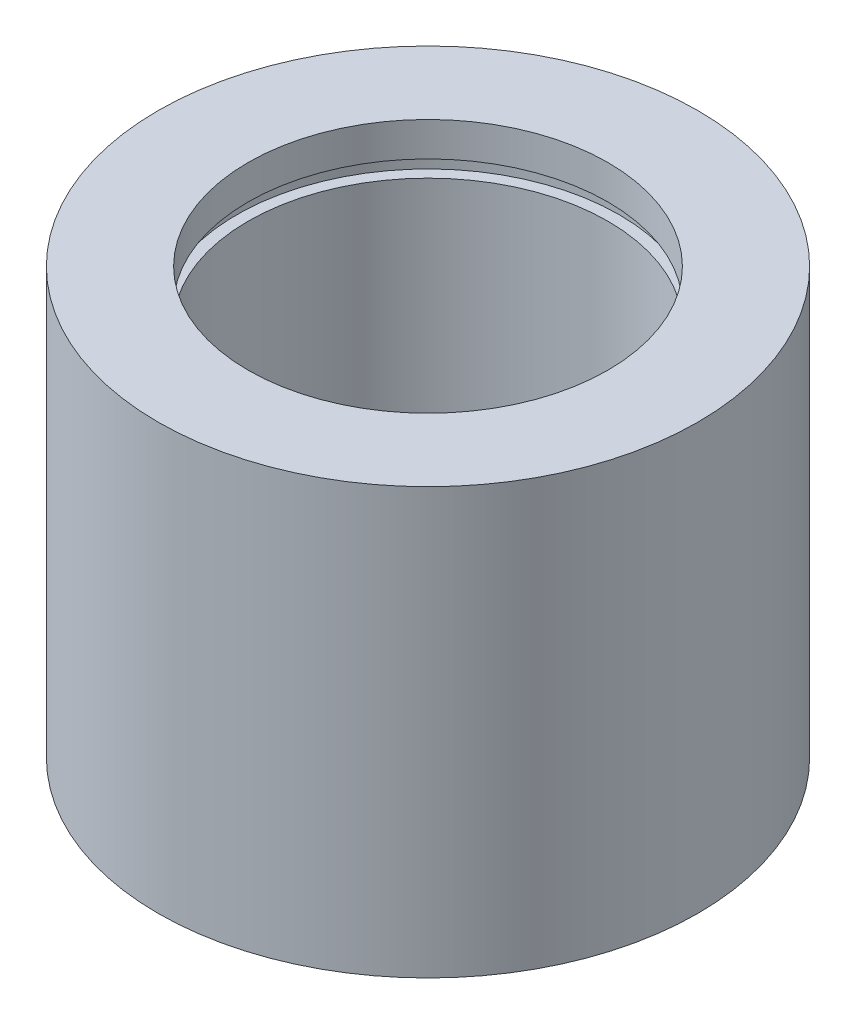
ISO-10303-21;
HEADER;
FILE_DESCRIPTION(('STEP AP214'),'2;1');
FILE_NAME('part.step','',(''),(''),'','','');
FILE_SCHEMA(('AUTOMOTIVE_DESIGN { 1 0 10303 214 1 1 1 1 }'));
ENDSEC;
DATA;
#1=APPLICATION_CONTEXT('core data for automotive mechanical design processes');
#2=APPLICATION_PROTOCOL_DEFINITION('international standard','automotive_design',2000,#1);
#3=PRODUCT_CONTEXT('',#1,'mechanical');
#4=PRODUCT('Part','Part','',(#3));
#5=PRODUCT_RELATED_PRODUCT_CATEGORY('part','',(#4));
#6=PRODUCT_DEFINITION_FORMATION('','',#4);
#7=PRODUCT_DEFINITION_CONTEXT('part definition',#1,'design');
#8=PRODUCT_DEFINITION('design','',#6,#7);
#9=PRODUCT_DEFINITION_SHAPE('','',#8);
#10=(LENGTH_UNIT() NAMED_UNIT(*) SI_UNIT(.MILLI.,.METRE.));
#11=(NAMED_UNIT(*) PLANE_ANGLE_UNIT() SI_UNIT($,.RADIAN.));
#12=(NAMED_UNIT(*) SI_UNIT($,.STERADIAN.) SOLID_ANGLE_UNIT());
#13=UNCERTAINTY_MEASURE_WITH_UNIT(LENGTH_MEASURE(1.E-05),#10,'distance_accuracy_value','');
#14=(GEOMETRIC_REPRESENTATION_CONTEXT(3) GLOBAL_UNCERTAINTY_ASSIGNED_CONTEXT((#13)) GLOBAL_UNIT_ASSIGNED_CONTEXT((#10,
#11,#12)) REPRESENTATION_CONTEXT('',''));
#15=CARTESIAN_POINT('',(0.,0.,0.));
#16=DIRECTION('',(0.,0.,1.));
#17=DIRECTION('',(1.,0.,0.));
#18=AXIS2_PLACEMENT_3D('',#15,#16,#17);
#19=CARTESIAN_POINT('',(0.,0.,0.));
#20=DIRECTION('',(0.,-1.,0.));
#21=DIRECTION('',(0.,0.,-1.));
#22=AXIS2_PLACEMENT_3D('',#19,#20,#21);
#23=CYLINDRICAL_SURFACE('',#22,20.);
#24=CARTESIAN_POINT('',(0.,0.,0.));
#25=DIRECTION('',(0.,-1.,0.));
#26=DIRECTION('',(0.,0.,-1.));
#27=AXIS2_PLACEMENT_3D('',#24,#25,#26);
#28=CIRCLE('',#27,20.);
#29=CARTESIAN_POINT('',(0.,0.,-20.));
#30=VERTEX_POINT('',#29);
#31=EDGE_CURVE('E10',#30,#30,#28,.T.);
#32=ORIENTED_EDGE('',*,*,#31,.T.);
#33=EDGE_LOOP('',(#32));
#34=FACE_BOUND('',#33,.T.);
#35=CARTESIAN_POINT('',(0.,3.8,0.));
#36=DIRECTION('',(0.,-1.,0.));
#37=DIRECTION('',(0.,0.,-1.));
#38=AXIS2_PLACEMENT_3D('',#35,#36,#37);
#39=CIRCLE('',#38,20.);
#40=CARTESIAN_POINT('',(0.,3.8,-20.));
#41=VERTEX_POINT('',#40);
#42=EDGE_CURVE('E86',#41,#41,#39,.T.);
#43=ORIENTED_EDGE('',*,*,#42,.F.);
#44=EDGE_LOOP('',(#43));
#45=FACE_BOUND('',#44,.T.);
#46=ADVANCED_FACE('F33',(#34,#45),#23,.F.);
#47=CARTESIAN_POINT('',(20.,0.,0.));
#48=DIRECTION('',(0.,-1.,0.));
#49=DIRECTION('',(0.,0.,-1.));
#50=AXIS2_PLACEMENT_3D('',#47,#48,#49);
#51=PLANE('',#50);
#52=CARTESIAN_POINT('',(0.,0.,0.));
#53=DIRECTION('',(0.,-1.,0.));
#54=DIRECTION('',(0.,0.,-1.));
#55=AXIS2_PLACEMENT_3D('',#52,#53,#54);
#56=CIRCLE('',#55,30.);
#57=CARTESIAN_POINT('',(0.,0.,-30.));
#58=VERTEX_POINT('',#57);
#59=EDGE_CURVE('E40',#58,#58,#56,.T.);
#60=ORIENTED_EDGE('',*,*,#59,.T.);
#61=EDGE_LOOP('',(#60));
#62=FACE_BOUND('',#61,.T.);
#63=ORIENTED_EDGE('',*,*,#31,.F.);
#64=EDGE_LOOP('',(#63));
#65=FACE_BOUND('',#64,.T.);
#66=ADVANCED_FACE('F96',(#62,#65),#51,.T.);
#67=CARTESIAN_POINT('',(0.,0.,0.));
#68=DIRECTION('',(0.,-1.,0.));
#69=DIRECTION('',(0.,0.,-1.));
#70=AXIS2_PLACEMENT_3D('',#67,#68,#69);
#71=CYLINDRICAL_SURFACE('',#70,30.);
#72=CARTESIAN_POINT('',(0.,47.3,0.));
#73=DIRECTION('',(0.,-1.,0.));
#74=DIRECTION('',(0.,0.,-1.));
#75=AXIS2_PLACEMENT_3D('',#72,#73,#74);
#76=CIRCLE('',#75,30.);
#77=CARTESIAN_POINT('',(0.,47.3,-30.));
#78=VERTEX_POINT('',#77);
#79=EDGE_CURVE('E46',#78,#78,#76,.T.);
#80=ORIENTED_EDGE('',*,*,#79,.T.);
#81=EDGE_LOOP('',(#80));
#82=FACE_BOUND('',#81,.T.);
#83=ORIENTED_EDGE('',*,*,#59,.F.);
#84=EDGE_LOOP('',(#83));
#85=FACE_BOUND('',#84,.T.);
#86=ADVANCED_FACE('F100',(#82,#85),#71,.T.);
#87=CARTESIAN_POINT('',(30.,47.3,0.));
#88=DIRECTION('',(0.,1.,0.));
#89=DIRECTION('',(0.,0.,1.));
#90=AXIS2_PLACEMENT_3D('',#87,#88,#89);
#91=PLANE('',#90);
#92=CARTESIAN_POINT('',(0.,47.3,0.));
#93=DIRECTION('',(0.,-1.,0.));
#94=DIRECTION('',(0.,0.,-1.));
#95=AXIS2_PLACEMENT_3D('',#92,#93,#94);
#96=CIRCLE('',#95,20.);
#97=CARTESIAN_POINT('',(0.,47.3,-20.));
#98=VERTEX_POINT('',#97);
#99=EDGE_CURVE('E52',#98,#98,#96,.T.);
#100=ORIENTED_EDGE('',*,*,#99,.T.);
#101=EDGE_LOOP('',(#100));
#102=FACE_BOUND('',#101,.T.);
#103=ORIENTED_EDGE('',*,*,#79,.F.);
#104=EDGE_LOOP('',(#103));
#105=FACE_BOUND('',#104,.T.);
#106=ADVANCED_FACE('F104',(#102,#105),#91,.T.);
#107=CARTESIAN_POINT('',(0.,0.,0.));
#108=DIRECTION('',(0.,-1.,0.));
#109=DIRECTION('',(0.,0.,-1.));
#110=AXIS2_PLACEMENT_3D('',#107,#108,#109);
#111=CYLINDRICAL_SURFACE('',#110,20.);
#112=CARTESIAN_POINT('',(0.,43.5,0.));
#113=DIRECTION('',(0.,-1.,0.));
#114=DIRECTION('',(0.,0.,-1.));
#115=AXIS2_PLACEMENT_3D('',#112,#113,#114);
#116=CIRCLE('',#115,20.);
#117=CARTESIAN_POINT('',(0.,43.5,-20.));
#118=VERTEX_POINT('',#117);
#119=EDGE_CURVE('E58',#118,#118,#116,.T.);
#120=ORIENTED_EDGE('',*,*,#119,.T.);
#121=EDGE_LOOP('',(#120));
#122=FACE_BOUND('',#121,.T.);
#123=ORIENTED_EDGE('',*,*,#99,.F.);
#124=EDGE_LOOP('',(#123));
#125=FACE_BOUND('',#124,.T.);
#126=ADVANCED_FACE('F111',(#122,#125),#111,.F.);
#127=CARTESIAN_POINT('',(20.,43.5,0.));
#128=DIRECTION('',(0.,-1.,0.));
#129=DIRECTION('',(0.,0.,-1.));
#130=AXIS2_PLACEMENT_3D('',#127,#128,#129);
#131=PLANE('',#130);
#132=CARTESIAN_POINT('',(0.,43.5,0.));
#133=DIRECTION('',(0.,-1.,0.));
#134=DIRECTION('',(0.,0.,-1.));
#135=AXIS2_PLACEMENT_3D('',#132,#133,#134);
#136=CIRCLE('',#135,21.25);
#137=CARTESIAN_POINT('',(0.,43.5,-21.25));
#138=VERTEX_POINT('',#137);
#139=EDGE_CURVE('E62',#138,#138,#136,.T.);
#140=ORIENTED_EDGE('',*,*,#139,.T.);
#141=EDGE_LOOP('',(#140));
#142=FACE_BOUND('',#141,.T.);
#143=ORIENTED_EDGE('',*,*,#119,.F.);
#144=EDGE_LOOP('',(#143));
#145=FACE_BOUND('',#144,.T.);
#146=ADVANCED_FACE('F115',(#142,#145),#131,.T.);
#147=CARTESIAN_POINT('',(0.,0.,0.));
#148=DIRECTION('',(0.,-1.,0.));
#149=DIRECTION('',(0.,0.,-1.));
#150=AXIS2_PLACEMENT_3D('',#147,#148,#149);
#151=CYLINDRICAL_SURFACE('',#150,21.25);
#152=CARTESIAN_POINT('',(0.,41.65,0.));
#153=DIRECTION('',(0.,-1.,0.));
#154=DIRECTION('',(0.,0.,-1.));
#155=AXIS2_PLACEMENT_3D('',#152,#153,#154);
#156=CIRCLE('',#155,21.25);
#157=CARTESIAN_POINT('',(0.,41.65,-21.25));
#158=VERTEX_POINT('',#157);
#159=EDGE_CURVE('E66',#158,#158,#156,.T.);
#160=ORIENTED_EDGE('',*,*,#159,.T.);
#161=EDGE_LOOP('',(#160));
#162=FACE_BOUND('',#161,.T.);
#163=ORIENTED_EDGE('',*,*,#139,.F.);
#164=EDGE_LOOP('',(#163));
#165=FACE_BOUND('',#164,.T.);
#166=ADVANCED_FACE('F119',(#162,#165),#151,.F.);
#167=CARTESIAN_POINT('',(21.25,41.65,0.));
#168=DIRECTION('',(0.,1.,0.));
#169=DIRECTION('',(0.,0.,1.));
#170=AXIS2_PLACEMENT_3D('',#167,#168,#169);
#171=PLANE('',#170);
#172=CARTESIAN_POINT('',(0.,41.65,0.));
#173=DIRECTION('',(0.,-1.,0.));
#174=DIRECTION('',(0.,0.,-1.));
#175=AXIS2_PLACEMENT_3D('',#172,#173,#174);
#176=CIRCLE('',#175,20.);
#177=CARTESIAN_POINT('',(0.,41.65,-20.));
#178=VERTEX_POINT('',#177);
#179=EDGE_CURVE('E70',#178,#178,#176,.T.);
#180=ORIENTED_EDGE('',*,*,#179,.T.);
#181=EDGE_LOOP('',(#180));
#182=FACE_BOUND('',#181,.T.);
#183=ORIENTED_EDGE('',*,*,#159,.F.);
#184=EDGE_LOOP('',(#183));
#185=FACE_BOUND('',#184,.T.);
#186=ADVANCED_FACE('F123',(#182,#185),#171,.T.);
#187=CARTESIAN_POINT('',(0.,0.,0.));
#188=DIRECTION('',(0.,-1.,0.));
#189=DIRECTION('',(0.,0.,-1.));
#190=AXIS2_PLACEMENT_3D('',#187,#188,#189);
#191=CYLINDRICAL_SURFACE('',#190,20.);
#192=CARTESIAN_POINT('',(0.,5.65,0.));
#193=DIRECTION('',(0.,-1.,0.));
#194=DIRECTION('',(0.,0.,-1.));
#195=AXIS2_PLACEMENT_3D('',#192,#193,#194);
#196=CIRCLE('',#195,20.);
#197=CARTESIAN_POINT('',(0.,5.65,-20.));
#198=VERTEX_POINT('',#197);
#199=EDGE_CURVE('E74',#198,#198,#196,.T.);
#200=ORIENTED_EDGE('',*,*,#199,.T.);
#201=EDGE_LOOP('',(#200));
#202=FACE_BOUND('',#201,.T.);
#203=ORIENTED_EDGE('',*,*,#179,.F.);
#204=EDGE_LOOP('',(#203));
#205=FACE_BOUND('',#204,.T.);
#206=ADVANCED_FACE('F127',(#202,#205),#191,.F.);
#207=CARTESIAN_POINT('',(20.,5.65,0.));
#208=DIRECTION('',(0.,-1.,0.));
#209=DIRECTION('',(0.,0.,-1.));
#210=AXIS2_PLACEMENT_3D('',#207,#208,#209);
#211=PLANE('',#210);
#212=CARTESIAN_POINT('',(0.,5.65,0.));
#213=DIRECTION('',(0.,-1.,0.));
#214=DIRECTION('',(0.,0.,-1.));
#215=AXIS2_PLACEMENT_3D('',#212,#213,#214);
#216=CIRCLE('',#215,21.25);
#217=CARTESIAN_POINT('',(0.,5.65,-21.25));
#218=VERTEX_POINT('',#217);
#219=EDGE_CURVE('E78',#218,#218,#216,.T.);
#220=ORIENTED_EDGE('',*,*,#219,.T.);
#221=EDGE_LOOP('',(#220));
#222=FACE_BOUND('',#221,.T.);
#223=ORIENTED_EDGE('',*,*,#199,.F.);
#224=EDGE_LOOP('',(#223));
#225=FACE_BOUND('',#224,.T.);
#226=ADVANCED_FACE('F131',(#222,#225),#211,.T.);
#227=CARTESIAN_POINT('',(0.,0.,0.));
#228=DIRECTION('',(0.,-1.,0.));
#229=DIRECTION('',(0.,0.,-1.));
#230=AXIS2_PLACEMENT_3D('',#227,#228,#229);
#231=CYLINDRICAL_SURFACE('',#230,21.25);
#232=CARTESIAN_POINT('',(0.,3.8,0.));
#233=DIRECTION('',(0.,-1.,0.));
#234=DIRECTION('',(0.,0.,-1.));
#235=AXIS2_PLACEMENT_3D('',#232,#233,#234);
#236=CIRCLE('',#235,21.25);
#237=CARTESIAN_POINT('',(0.,3.8,-21.25));
#238=VERTEX_POINT('',#237);
#239=EDGE_CURVE('E82',#238,#238,#236,.T.);
#240=ORIENTED_EDGE('',*,*,#239,.T.);
#241=EDGE_LOOP('',(#240));
#242=FACE_BOUND('',#241,.T.);
#243=ORIENTED_EDGE('',*,*,#219,.F.);
#244=EDGE_LOOP('',(#243));
#245=FACE_BOUND('',#244,.T.);
#246=ADVANCED_FACE('F135',(#242,#245),#231,.F.);
#247=CARTESIAN_POINT('',(21.25,3.8,0.));
#248=DIRECTION('',(0.,1.,0.));
#249=DIRECTION('',(0.,0.,1.));
#250=AXIS2_PLACEMENT_3D('',#247,#248,#249);
#251=PLANE('',#250);
#252=ORIENTED_EDGE('',*,*,#42,.T.);
#253=EDGE_LOOP('',(#252));
#254=FACE_BOUND('',#253,.T.);
#255=ORIENTED_EDGE('',*,*,#239,.F.);
#256=EDGE_LOOP('',(#255));
#257=FACE_BOUND('',#256,.T.);
#258=ADVANCED_FACE('F92',(#254,#257),#251,.T.);
#259=CLOSED_SHELL('',(#46,#66,#86,#106,#126,#146,#166,#186,#206,#226,#246,#258));
#260=MANIFOLD_SOLID_BREP('B2',#259);
#261=ADVANCED_BREP_SHAPE_REPRESENTATION('',(#18,#260),#14);
#262=SHAPE_DEFINITION_REPRESENTATION(#9,#261);
ENDSEC;
END-ISO-10303-21;
